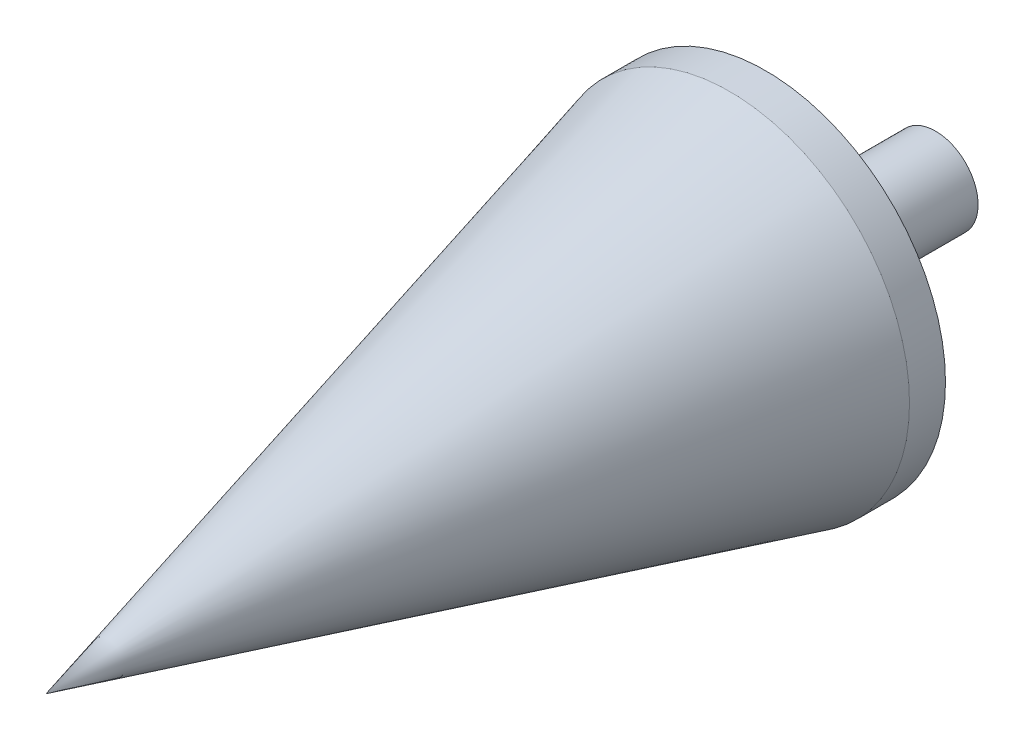
ISO-10303-21;
HEADER;
FILE_DESCRIPTION(('STEP AP214'),'2;1');
FILE_NAME('part.step','',(''),(''),'','','');
FILE_SCHEMA(('AUTOMOTIVE_DESIGN { 1 0 10303 214 1 1 1 1 }'));
ENDSEC;
DATA;
#1=APPLICATION_CONTEXT('core data for automotive mechanical design processes');
#2=APPLICATION_PROTOCOL_DEFINITION('international standard','automotive_design',2000,#1);
#3=PRODUCT_CONTEXT('',#1,'mechanical');
#4=PRODUCT('Part','Part','',(#3));
#5=PRODUCT_RELATED_PRODUCT_CATEGORY('part','',(#4));
#6=PRODUCT_DEFINITION_FORMATION('','',#4);
#7=PRODUCT_DEFINITION_CONTEXT('part definition',#1,'design');
#8=PRODUCT_DEFINITION('design','',#6,#7);
#9=PRODUCT_DEFINITION_SHAPE('','',#8);
#10=(LENGTH_UNIT() NAMED_UNIT(*) SI_UNIT(.MILLI.,.METRE.));
#11=(NAMED_UNIT(*) PLANE_ANGLE_UNIT() SI_UNIT($,.RADIAN.));
#12=(NAMED_UNIT(*) SI_UNIT($,.STERADIAN.) SOLID_ANGLE_UNIT());
#13=UNCERTAINTY_MEASURE_WITH_UNIT(LENGTH_MEASURE(1.E-05),#10,'distance_accuracy_value','');
#14=(GEOMETRIC_REPRESENTATION_CONTEXT(3) GLOBAL_UNCERTAINTY_ASSIGNED_CONTEXT((#13)) GLOBAL_UNIT_ASSIGNED_CONTEXT((#10,
#11,#12)) REPRESENTATION_CONTEXT('',''));
#15=CARTESIAN_POINT('',(0.,0.,0.));
#16=DIRECTION('',(0.,0.,1.));
#17=DIRECTION('',(1.,0.,0.));
#18=AXIS2_PLACEMENT_3D('',#15,#16,#17);
#19=CARTESIAN_POINT('',(0.,0.,1.27));
#20=DIRECTION('',(0.,0.,-1.));
#21=DIRECTION('',(-1.,0.,0.));
#22=AXIS2_PLACEMENT_3D('',#19,#20,#21);
#23=CYLINDRICAL_SURFACE('',#22,6.35);
#24=CARTESIAN_POINT('',(0.,0.,1.27));
#25=DIRECTION('',(0.,0.,1.));
#26=DIRECTION('',(1.,0.,0.));
#27=AXIS2_PLACEMENT_3D('',#24,#25,#26);
#28=CIRCLE('',#27,6.35);
#29=CARTESIAN_POINT('',(6.35,0.,1.27));
#30=VERTEX_POINT('',#29);
#31=EDGE_CURVE('E48',#30,#30,#28,.T.);
#32=ORIENTED_EDGE('',*,*,#31,.F.);
#33=EDGE_LOOP('',(#32));
#34=FACE_BOUND('',#33,.T.);
#35=CARTESIAN_POINT('',(0.,0.,0.));
#36=DIRECTION('',(0.,0.,1.));
#37=DIRECTION('',(1.,0.,0.));
#38=AXIS2_PLACEMENT_3D('',#35,#36,#37);
#39=CIRCLE('',#38,6.35);
#40=CARTESIAN_POINT('',(6.35,0.,0.));
#41=VERTEX_POINT('',#40);
#42=EDGE_CURVE('E43',#41,#41,#39,.T.);
#43=ORIENTED_EDGE('',*,*,#42,.T.);
#44=EDGE_LOOP('',(#43));
#45=FACE_BOUND('',#44,.T.);
#46=ADVANCED_FACE('F40',(#34,#45),#23,.T.);
#47=CARTESIAN_POINT('',(0.,0.,0.));
#48=DIRECTION('',(0.,0.,1.));
#49=DIRECTION('',(1.,0.,0.));
#50=AXIS2_PLACEMENT_3D('',#47,#48,#49);
#51=PLANE('',#50);
#52=CARTESIAN_POINT('',(0.,0.,0.));
#53=DIRECTION('',(0.,0.,-1.));
#54=DIRECTION('',(-1.,0.,0.));
#55=AXIS2_PLACEMENT_3D('',#52,#53,#54);
#56=CIRCLE('',#55,1.5);
#57=CARTESIAN_POINT('',(-1.5,0.,0.));
#58=VERTEX_POINT('',#57);
#59=EDGE_CURVE('E12',#58,#58,#56,.T.);
#60=ORIENTED_EDGE('',*,*,#59,.F.);
#61=EDGE_LOOP('',(#60));
#62=FACE_BOUND('',#61,.T.);
#63=ORIENTED_EDGE('',*,*,#42,.F.);
#64=EDGE_LOOP('',(#63));
#65=FACE_BOUND('',#64,.T.);
#66=ADVANCED_FACE('F55',(#62,#65),#51,.F.);
#67=CARTESIAN_POINT('',(0.,0.,25.4));
#68=DIRECTION('',(0.,0.,-1.));
#69=DIRECTION('',(-1.,0.,0.));
#70=AXIS2_PLACEMENT_3D('',#67,#68,#69);
#71=CONICAL_SURFACE('',#70,0.,0.257323714971089);
#72=ORIENTED_EDGE('',*,*,#31,.T.);
#73=EDGE_LOOP('',(#72));
#74=FACE_BOUND('',#73,.T.);
#75=CARTESIAN_POINT('',(0.,0.,25.4));
#76=VERTEX_POINT('',#75);
#77=VERTEX_LOOP('',#76);
#78=FACE_BOUND('',#77,.T.);
#79=ADVANCED_FACE('F52',(#74,#78),#71,.T.);
#80=CARTESIAN_POINT('',(0.,0.,-6.));
#81=DIRECTION('',(0.,0.,1.));
#82=DIRECTION('',(1.,0.,0.));
#83=AXIS2_PLACEMENT_3D('',#80,#81,#82);
#84=CYLINDRICAL_SURFACE('',#83,1.5);
#85=CARTESIAN_POINT('',(0.,0.,-6.));
#86=DIRECTION('',(0.,0.,-1.));
#87=DIRECTION('',(-1.,0.,0.));
#88=AXIS2_PLACEMENT_3D('',#85,#86,#87);
#89=CIRCLE('',#88,1.5);
#90=CARTESIAN_POINT('',(-1.5,0.,-6.));
#91=VERTEX_POINT('',#90);
#92=EDGE_CURVE('E77',#91,#91,#89,.T.);
#93=ORIENTED_EDGE('',*,*,#92,.F.);
#94=EDGE_LOOP('',(#93));
#95=FACE_BOUND('',#94,.T.);
#96=ORIENTED_EDGE('',*,*,#59,.T.);
#97=EDGE_LOOP('',(#96));
#98=FACE_BOUND('',#97,.T.);
#99=ADVANCED_FACE('F54',(#95,#98),#84,.T.);
#100=CARTESIAN_POINT('',(0.,0.,-6.));
#101=DIRECTION('',(0.,0.,-1.));
#102=DIRECTION('',(-1.,0.,0.));
#103=AXIS2_PLACEMENT_3D('',#100,#101,#102);
#104=PLANE('',#103);
#105=ORIENTED_EDGE('',*,*,#92,.T.);
#106=EDGE_LOOP('',(#105));
#107=FACE_BOUND('',#106,.T.);
#108=ADVANCED_FACE('F62',(#107),#104,.T.);
#109=CLOSED_SHELL('',(#46,#66,#79,#99,#108));
#110=MANIFOLD_SOLID_BREP('B2',#109);
#111=ADVANCED_BREP_SHAPE_REPRESENTATION('',(#18,#110),#14);
#112=SHAPE_DEFINITION_REPRESENTATION(#9,#111);
ENDSEC;
END-ISO-10303-21;
